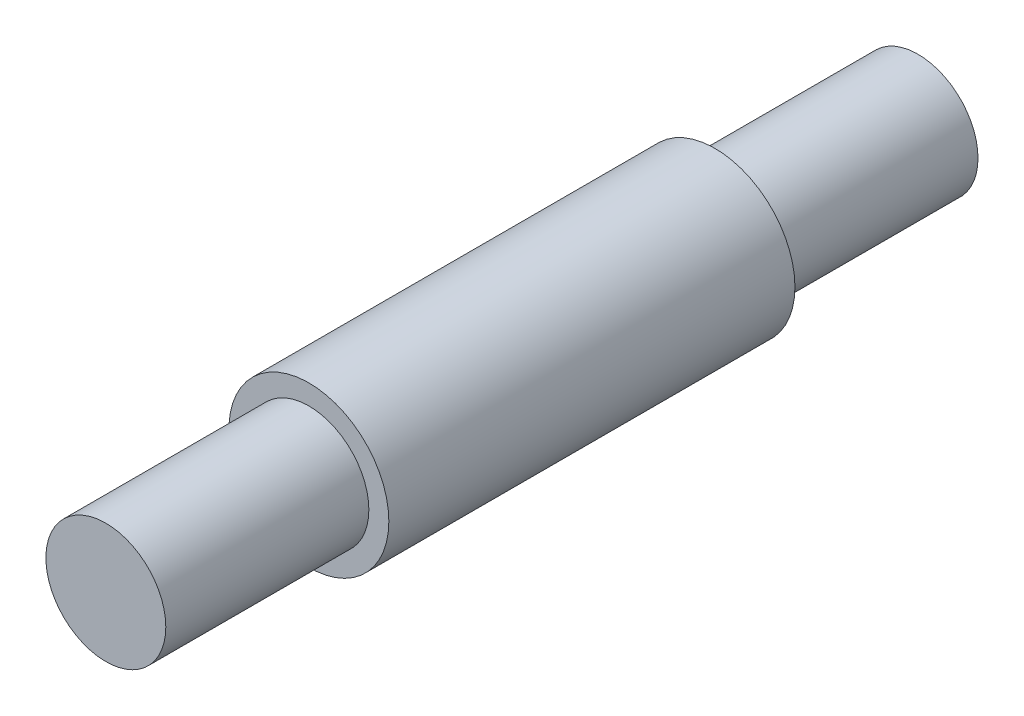
ISO-10303-21;
HEADER;
FILE_DESCRIPTION(('STEP AP214'),'2;1');
FILE_NAME('part.step','',(''),(''),'','','');
FILE_SCHEMA(('AUTOMOTIVE_DESIGN { 1 0 10303 214 1 1 1 1 }'));
ENDSEC;
DATA;
#1=APPLICATION_CONTEXT('core data for automotive mechanical design processes');
#2=APPLICATION_PROTOCOL_DEFINITION('international standard','automotive_design',2000,#1);
#3=PRODUCT_CONTEXT('',#1,'mechanical');
#4=PRODUCT('Part','Part','',(#3));
#5=PRODUCT_RELATED_PRODUCT_CATEGORY('part','',(#4));
#6=PRODUCT_DEFINITION_FORMATION('','',#4);
#7=PRODUCT_DEFINITION_CONTEXT('part definition',#1,'design');
#8=PRODUCT_DEFINITION('design','',#6,#7);
#9=PRODUCT_DEFINITION_SHAPE('','',#8);
#10=(LENGTH_UNIT() NAMED_UNIT(*) SI_UNIT(.MILLI.,.METRE.));
#11=(NAMED_UNIT(*) PLANE_ANGLE_UNIT() SI_UNIT($,.RADIAN.));
#12=(NAMED_UNIT(*) SI_UNIT($,.STERADIAN.) SOLID_ANGLE_UNIT());
#13=UNCERTAINTY_MEASURE_WITH_UNIT(LENGTH_MEASURE(1.E-05),#10,'distance_accuracy_value','');
#14=(GEOMETRIC_REPRESENTATION_CONTEXT(3) GLOBAL_UNCERTAINTY_ASSIGNED_CONTEXT((#13)) GLOBAL_UNIT_ASSIGNED_CONTEXT((#10,
#11,#12)) REPRESENTATION_CONTEXT('',''));
#15=CARTESIAN_POINT('',(0.,0.,0.));
#16=DIRECTION('',(0.,0.,1.));
#17=DIRECTION('',(1.,0.,0.));
#18=AXIS2_PLACEMENT_3D('',#15,#16,#17);
#19=CARTESIAN_POINT('',(0.,0.,-40.));
#20=DIRECTION('',(0.,0.,1.));
#21=DIRECTION('',(1.,0.,0.));
#22=AXIS2_PLACEMENT_3D('',#19,#20,#21);
#23=PLANE('',#22);
#24=CARTESIAN_POINT('',(0.,0.,-40.));
#25=DIRECTION('',(0.,0.,1.));
#26=DIRECTION('',(1.,0.,0.));
#27=AXIS2_PLACEMENT_3D('',#24,#25,#26);
#28=CIRCLE('',#27,5.90625000000001);
#29=CARTESIAN_POINT('',(5.90625000000001,0.,-40.));
#30=VERTEX_POINT('',#29);
#31=EDGE_CURVE('E10',#30,#30,#28,.T.);
#32=ORIENTED_EDGE('',*,*,#31,.F.);
#33=EDGE_LOOP('',(#32));
#34=FACE_BOUND('',#33,.T.);
#35=ADVANCED_FACE('F34',(#34),#23,.F.);
#36=CARTESIAN_POINT('',(0.,0.,61.5315));
#37=DIRECTION('',(0.,0.,1.));
#38=DIRECTION('',(1.,0.,0.));
#39=AXIS2_PLACEMENT_3D('',#36,#37,#38);
#40=CYLINDRICAL_SURFACE('',#39,5.90625000000001);
#41=CARTESIAN_POINT('',(0.,0.,-20.));
#42=DIRECTION('',(0.,0.,1.));
#43=DIRECTION('',(1.,0.,0.));
#44=AXIS2_PLACEMENT_3D('',#41,#42,#43);
#45=CIRCLE('',#44,5.90625000000001);
#46=CARTESIAN_POINT('',(5.90625000000001,0.,-20.));
#47=VERTEX_POINT('',#46);
#48=EDGE_CURVE('E40',#47,#47,#45,.T.);
#49=ORIENTED_EDGE('',*,*,#48,.F.);
#50=EDGE_LOOP('',(#49));
#51=FACE_BOUND('',#50,.T.);
#52=ORIENTED_EDGE('',*,*,#31,.T.);
#53=EDGE_LOOP('',(#52));
#54=FACE_BOUND('',#53,.T.);
#55=ADVANCED_FACE('F76',(#51,#54),#40,.T.);
#56=CARTESIAN_POINT('',(0.,5.90625000000001,-20.));
#57=DIRECTION('',(0.,0.,1.));
#58=DIRECTION('',(1.,0.,0.));
#59=AXIS2_PLACEMENT_3D('',#56,#57,#58);
#60=PLANE('',#59);
#61=CARTESIAN_POINT('',(0.,0.,-20.));
#62=DIRECTION('',(0.,0.,1.));
#63=DIRECTION('',(1.,0.,0.));
#64=AXIS2_PLACEMENT_3D('',#61,#62,#63);
#65=CIRCLE('',#64,7.87500000000001);
#66=CARTESIAN_POINT('',(7.87500000000001,0.,-20.));
#67=VERTEX_POINT('',#66);
#68=EDGE_CURVE('E44',#67,#67,#65,.T.);
#69=ORIENTED_EDGE('',*,*,#68,.F.);
#70=EDGE_LOOP('',(#69));
#71=FACE_BOUND('',#70,.T.);
#72=ORIENTED_EDGE('',*,*,#48,.T.);
#73=EDGE_LOOP('',(#72));
#74=FACE_BOUND('',#73,.T.);
#75=ADVANCED_FACE('F81',(#71,#74),#60,.F.);
#76=CARTESIAN_POINT('',(0.,0.,61.5315));
#77=DIRECTION('',(0.,0.,1.));
#78=DIRECTION('',(1.,0.,0.));
#79=AXIS2_PLACEMENT_3D('',#76,#77,#78);
#80=CYLINDRICAL_SURFACE('',#79,7.875);
#81=ORIENTED_EDGE('',*,*,#68,.T.);
#82=EDGE_LOOP('',(#81));
#83=FACE_BOUND('',#82,.T.);
#84=CARTESIAN_POINT('',(0.,0.,20.));
#85=DIRECTION('',(0.,0.,1.));
#86=DIRECTION('',(1.,0.,0.));
#87=AXIS2_PLACEMENT_3D('',#84,#85,#86);
#88=CIRCLE('',#87,7.875);
#89=CARTESIAN_POINT('',(7.875,0.,20.));
#90=VERTEX_POINT('',#89);
#91=EDGE_CURVE('E48',#90,#90,#88,.T.);
#92=ORIENTED_EDGE('',*,*,#91,.F.);
#93=EDGE_LOOP('',(#92));
#94=FACE_BOUND('',#93,.T.);
#95=ADVANCED_FACE('F72',(#83,#94),#80,.T.);
#96=CARTESIAN_POINT('',(0.,5.90625,20.));
#97=DIRECTION('',(0.,0.,1.));
#98=DIRECTION('',(1.,0.,0.));
#99=AXIS2_PLACEMENT_3D('',#96,#97,#98);
#100=PLANE('',#99);
#101=ORIENTED_EDGE('',*,*,#91,.T.);
#102=EDGE_LOOP('',(#101));
#103=FACE_BOUND('',#102,.T.);
#104=CARTESIAN_POINT('',(0.,0.,20.));
#105=DIRECTION('',(0.,0.,1.));
#106=DIRECTION('',(1.,0.,0.));
#107=AXIS2_PLACEMENT_3D('',#104,#105,#106);
#108=CIRCLE('',#107,5.90625);
#109=CARTESIAN_POINT('',(5.90625,0.,20.));
#110=VERTEX_POINT('',#109);
#111=EDGE_CURVE('E53',#110,#110,#108,.T.);
#112=ORIENTED_EDGE('',*,*,#111,.F.);
#113=EDGE_LOOP('',(#112));
#114=FACE_BOUND('',#113,.T.);
#115=ADVANCED_FACE('F64',(#103,#114),#100,.T.);
#116=CARTESIAN_POINT('',(0.,0.,61.5315));
#117=DIRECTION('',(0.,0.,1.));
#118=DIRECTION('',(1.,0.,0.));
#119=AXIS2_PLACEMENT_3D('',#116,#117,#118);
#120=CYLINDRICAL_SURFACE('',#119,5.90625);
#121=ORIENTED_EDGE('',*,*,#111,.T.);
#122=EDGE_LOOP('',(#121));
#123=FACE_BOUND('',#122,.T.);
#124=CARTESIAN_POINT('',(0.,0.,40.));
#125=DIRECTION('',(0.,0.,1.));
#126=DIRECTION('',(1.,0.,0.));
#127=AXIS2_PLACEMENT_3D('',#124,#125,#126);
#128=CIRCLE('',#127,5.90625);
#129=CARTESIAN_POINT('',(5.90625,0.,40.));
#130=VERTEX_POINT('',#129);
#131=EDGE_CURVE('E56',#130,#130,#128,.T.);
#132=ORIENTED_EDGE('',*,*,#131,.F.);
#133=EDGE_LOOP('',(#132));
#134=FACE_BOUND('',#133,.T.);
#135=ADVANCED_FACE('F62',(#123,#134),#120,.T.);
#136=CARTESIAN_POINT('',(0.,0.,40.));
#137=DIRECTION('',(0.,0.,1.));
#138=DIRECTION('',(1.,0.,0.));
#139=AXIS2_PLACEMENT_3D('',#136,#137,#138);
#140=PLANE('',#139);
#141=ORIENTED_EDGE('',*,*,#131,.T.);
#142=EDGE_LOOP('',(#141));
#143=FACE_BOUND('',#142,.T.);
#144=ADVANCED_FACE('F60',(#143),#140,.T.);
#145=CLOSED_SHELL('',(#35,#55,#75,#95,#115,#135,#144));
#146=MANIFOLD_SOLID_BREP('B2',#145);
#147=ADVANCED_BREP_SHAPE_REPRESENTATION('',(#18,#146),#14);
#148=SHAPE_DEFINITION_REPRESENTATION(#9,#147);
ENDSEC;
END-ISO-10303-21;
